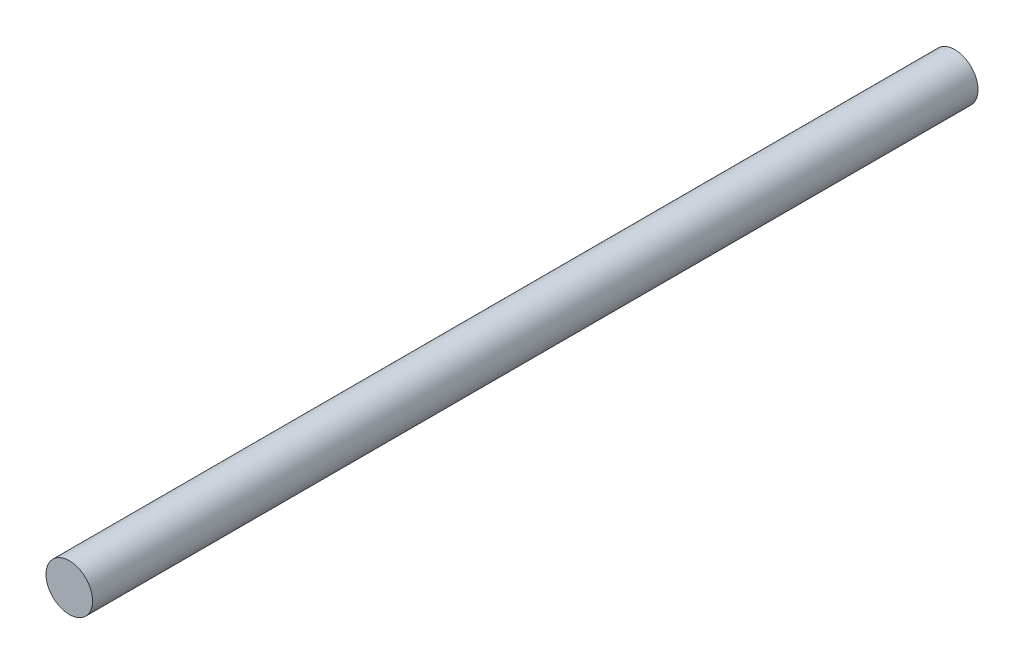
ISO-10303-21;
HEADER;
FILE_DESCRIPTION(('STEP AP214'),'2;1');
FILE_NAME('part.step','',(''),(''),'','','');
FILE_SCHEMA(('AUTOMOTIVE_DESIGN { 1 0 10303 214 1 1 1 1 }'));
ENDSEC;
DATA;
#1=APPLICATION_CONTEXT('core data for automotive mechanical design processes');
#2=APPLICATION_PROTOCOL_DEFINITION('international standard','automotive_design',2000,#1);
#3=PRODUCT_CONTEXT('',#1,'mechanical');
#4=PRODUCT('Part','Part','',(#3));
#5=PRODUCT_RELATED_PRODUCT_CATEGORY('part','',(#4));
#6=PRODUCT_DEFINITION_FORMATION('','',#4);
#7=PRODUCT_DEFINITION_CONTEXT('part definition',#1,'design');
#8=PRODUCT_DEFINITION('design','',#6,#7);
#9=PRODUCT_DEFINITION_SHAPE('','',#8);
#10=(LENGTH_UNIT() NAMED_UNIT(*) SI_UNIT(.MILLI.,.METRE.));
#11=(NAMED_UNIT(*) PLANE_ANGLE_UNIT() SI_UNIT($,.RADIAN.));
#12=(NAMED_UNIT(*) SI_UNIT($,.STERADIAN.) SOLID_ANGLE_UNIT());
#13=UNCERTAINTY_MEASURE_WITH_UNIT(LENGTH_MEASURE(1.E-05),#10,'distance_accuracy_value','');
#14=(GEOMETRIC_REPRESENTATION_CONTEXT(3) GLOBAL_UNCERTAINTY_ASSIGNED_CONTEXT((#13)) GLOBAL_UNIT_ASSIGNED_CONTEXT((#10,
#11,#12)) REPRESENTATION_CONTEXT('',''));
#15=CARTESIAN_POINT('',(0.,0.,0.));
#16=DIRECTION('',(0.,0.,1.));
#17=DIRECTION('',(1.,0.,0.));
#18=AXIS2_PLACEMENT_3D('',#15,#16,#17);
#19=CARTESIAN_POINT('',(0.,0.,120.65));
#20=DIRECTION('',(0.,0.,-1.));
#21=DIRECTION('',(-1.,0.,0.));
#22=AXIS2_PLACEMENT_3D('',#19,#20,#21);
#23=CYLINDRICAL_SURFACE('',#22,3.175);
#24=CARTESIAN_POINT('',(0.,0.,120.65));
#25=DIRECTION('',(0.,0.,1.));
#26=DIRECTION('',(1.,0.,0.));
#27=AXIS2_PLACEMENT_3D('',#24,#25,#26);
#28=CIRCLE('',#27,3.175);
#29=CARTESIAN_POINT('',(-3.175,0.,120.65));
#30=VERTEX_POINT('',#29);
#31=EDGE_CURVE('E10',#30,#30,#28,.T.);
#32=CARTESIAN_POINT('',(0.,0.,0.));
#33=DIRECTION('',(0.,0.,1.));
#34=DIRECTION('',(1.,0.,0.));
#35=AXIS2_PLACEMENT_3D('',#32,#33,#34);
#36=CIRCLE('',#35,3.175);
#37=CARTESIAN_POINT('',(-3.175,0.,0.));
#38=VERTEX_POINT('',#37);
#39=EDGE_CURVE('E46',#38,#38,#36,.T.);
#40=CARTESIAN_POINT('',(-3.175,0.,120.65));
#41=CARTESIAN_POINT('',(-3.175,0.,119.393229166667));
#42=CARTESIAN_POINT('',(-3.175,0.,118.136458333333));
#43=CARTESIAN_POINT('',(-3.175,0.,115.622916666667));
#44=CARTESIAN_POINT('',(-3.175,0.,114.366145833333));
#45=CARTESIAN_POINT('',(-3.175,0.,111.852604166667));
#46=CARTESIAN_POINT('',(-3.175,0.,110.595833333333));
#47=CARTESIAN_POINT('',(-3.175,0.,108.082291666667));
#48=CARTESIAN_POINT('',(-3.175,0.,106.825520833333));
#49=CARTESIAN_POINT('',(-3.175,0.,104.311979166667));
#50=CARTESIAN_POINT('',(-3.175,0.,103.055208333333));
#51=CARTESIAN_POINT('',(-3.175,0.,100.541666666667));
#52=CARTESIAN_POINT('',(-3.175,0.,99.2848958333333));
#53=CARTESIAN_POINT('',(-3.175,0.,96.7713541666667));
#54=CARTESIAN_POINT('',(-3.175,0.,95.5145833333333));
#55=CARTESIAN_POINT('',(-3.175,0.,93.0010416666667));
#56=CARTESIAN_POINT('',(-3.175,0.,91.7442708333333));
#57=CARTESIAN_POINT('',(-3.175,0.,89.2307291666667));
#58=CARTESIAN_POINT('',(-3.175,0.,87.9739583333333));
#59=CARTESIAN_POINT('',(-3.175,0.,85.4604166666667));
#60=CARTESIAN_POINT('',(-3.175,0.,84.2036458333333));
#61=CARTESIAN_POINT('',(-3.175,0.,81.6901041666667));
#62=CARTESIAN_POINT('',(-3.175,0.,80.4333333333333));
#63=CARTESIAN_POINT('',(-3.175,0.,77.9197916666667));
#64=CARTESIAN_POINT('',(-3.175,0.,76.6630208333333));
#65=CARTESIAN_POINT('',(-3.175,0.,74.1494791666667));
#66=CARTESIAN_POINT('',(-3.175,0.,72.8927083333333));
#67=CARTESIAN_POINT('',(-3.175,0.,70.3791666666667));
#68=CARTESIAN_POINT('',(-3.175,0.,69.1223958333333));
#69=CARTESIAN_POINT('',(-3.175,0.,66.6088541666667));
#70=CARTESIAN_POINT('',(-3.175,0.,65.3520833333333));
#71=CARTESIAN_POINT('',(-3.175,0.,62.8385416666667));
#72=CARTESIAN_POINT('',(-3.175,0.,61.5817708333333));
#73=CARTESIAN_POINT('',(-3.175,0.,59.0682291666667));
#74=CARTESIAN_POINT('',(-3.175,0.,57.8114583333333));
#75=CARTESIAN_POINT('',(-3.175,0.,55.2979166666667));
#76=CARTESIAN_POINT('',(-3.175,0.,54.0411458333333));
#77=CARTESIAN_POINT('',(-3.175,0.,51.5276041666667));
#78=CARTESIAN_POINT('',(-3.175,0.,50.2708333333333));
#79=CARTESIAN_POINT('',(-3.175,0.,47.7572916666667));
#80=CARTESIAN_POINT('',(-3.175,0.,46.5005208333333));
#81=CARTESIAN_POINT('',(-3.175,0.,43.9869791666667));
#82=CARTESIAN_POINT('',(-3.175,0.,42.7302083333333));
#83=CARTESIAN_POINT('',(-3.175,0.,40.2166666666667));
#84=CARTESIAN_POINT('',(-3.175,0.,38.9598958333333));
#85=CARTESIAN_POINT('',(-3.175,0.,36.4463541666667));
#86=CARTESIAN_POINT('',(-3.175,0.,35.1895833333333));
#87=CARTESIAN_POINT('',(-3.175,0.,32.6760416666667));
#88=CARTESIAN_POINT('',(-3.175,0.,31.4192708333333));
#89=CARTESIAN_POINT('',(-3.175,0.,28.9057291666667));
#90=CARTESIAN_POINT('',(-3.175,0.,27.6489583333333));
#91=CARTESIAN_POINT('',(-3.175,0.,25.1354166666667));
#92=CARTESIAN_POINT('',(-3.175,0.,23.8786458333333));
#93=CARTESIAN_POINT('',(-3.175,0.,21.3651041666667));
#94=CARTESIAN_POINT('',(-3.175,0.,20.1083333333333));
#95=CARTESIAN_POINT('',(-3.175,0.,17.5947916666667));
#96=CARTESIAN_POINT('',(-3.175,0.,16.3380208333333));
#97=CARTESIAN_POINT('',(-3.175,0.,13.8244791666667));
#98=CARTESIAN_POINT('',(-3.175,0.,12.5677083333333));
#99=CARTESIAN_POINT('',(-3.175,0.,10.0541666666667));
#100=CARTESIAN_POINT('',(-3.175,0.,8.79739583333333));
#101=CARTESIAN_POINT('',(-3.175,0.,6.28385416666666));
#102=CARTESIAN_POINT('',(-3.175,0.,5.02708333333333));
#103=CARTESIAN_POINT('',(-3.175,0.,2.51354166666667));
#104=CARTESIAN_POINT('',(-3.175,0.,1.25677083333333));
#105=CARTESIAN_POINT('',(-3.175,0.,0.));
#106=B_SPLINE_CURVE_WITH_KNOTS('',3,(#40,#41,#42,#43,#44,#45,#46,#47,#48,#49,#50,#51,#52,#53,
#54,#55,#56,#57,#58,#59,#60,#61,#62,#63,#64,#65,#66,#67,#68,#69,#70,#71,#72,#73,#74,#75,#76,#77,
#78,#79,#80,#81,#82,#83,#84,#85,#86,#87,#88,#89,#90,#91,#92,#93,#94,#95,#96,#97,#98,#99,#100,
#101,#102,#103,#104,#105),.UNSPECIFIED.,.F.,.F.,(4,2,2,2,2,2,2,2,2,2,2,2,2,2,2,2,2,2,2,2,2,2,2,
2,2,2,2,2,2,2,2,2,4),(0.,3.7703125,7.540625,11.3109375,15.08125,18.8515625,22.621875,26.3921875,
30.1625,33.9328125,37.703125,41.4734375,45.24375,49.0140625,52.784375,56.5546875,60.325,
64.0953125,67.865625,71.6359375,75.40625,79.1765625,82.946875,86.7171875,90.4875,94.2578125,
98.028125,101.7984375,105.56875,109.3390625,113.109375,116.8796875,120.65),.UNSPECIFIED.);
#107=EDGE_CURVE('BSEAM43',#30,#38,#106,.T.);
#108=ORIENTED_EDGE('',*,*,#31,.F.);
#109=ORIENTED_EDGE('',*,*,#39,.T.);
#110=ORIENTED_EDGE('',*,*,#107,.T.);
#111=ORIENTED_EDGE('',*,*,#107,.F.);
#112=EDGE_LOOP('',(#108,#110,#109,#111));
#113=FACE_BOUND('',#112,.T.);
#114=ADVANCED_FACE('F43',(#113),#23,.T.);
#115=CARTESIAN_POINT('',(0.,0.,120.65));
#116=DIRECTION('',(0.,0.,1.));
#117=DIRECTION('',(1.,0.,0.));
#118=AXIS2_PLACEMENT_3D('',#115,#116,#117);
#119=PLANE('',#118);
#120=ORIENTED_EDGE('',*,*,#31,.T.);
#121=EDGE_LOOP('',(#120));
#122=FACE_BOUND('',#121,.T.);
#123=ADVANCED_FACE('F60',(#122),#119,.T.);
#124=CARTESIAN_POINT('',(0.,0.,0.));
#125=DIRECTION('',(0.,0.,1.));
#126=DIRECTION('',(1.,0.,0.));
#127=AXIS2_PLACEMENT_3D('',#124,#125,#126);
#128=PLANE('',#127);
#129=ORIENTED_EDGE('',*,*,#39,.F.);
#130=EDGE_LOOP('',(#129));
#131=FACE_BOUND('',#130,.T.);
#132=ADVANCED_FACE('F58',(#131),#128,.F.);
#133=CLOSED_SHELL('',(#114,#123,#132));
#134=MANIFOLD_SOLID_BREP('B2',#133);
#135=ADVANCED_BREP_SHAPE_REPRESENTATION('',(#18,#134),#14);
#136=SHAPE_DEFINITION_REPRESENTATION(#9,#135);
ENDSEC;
END-ISO-10303-21;
